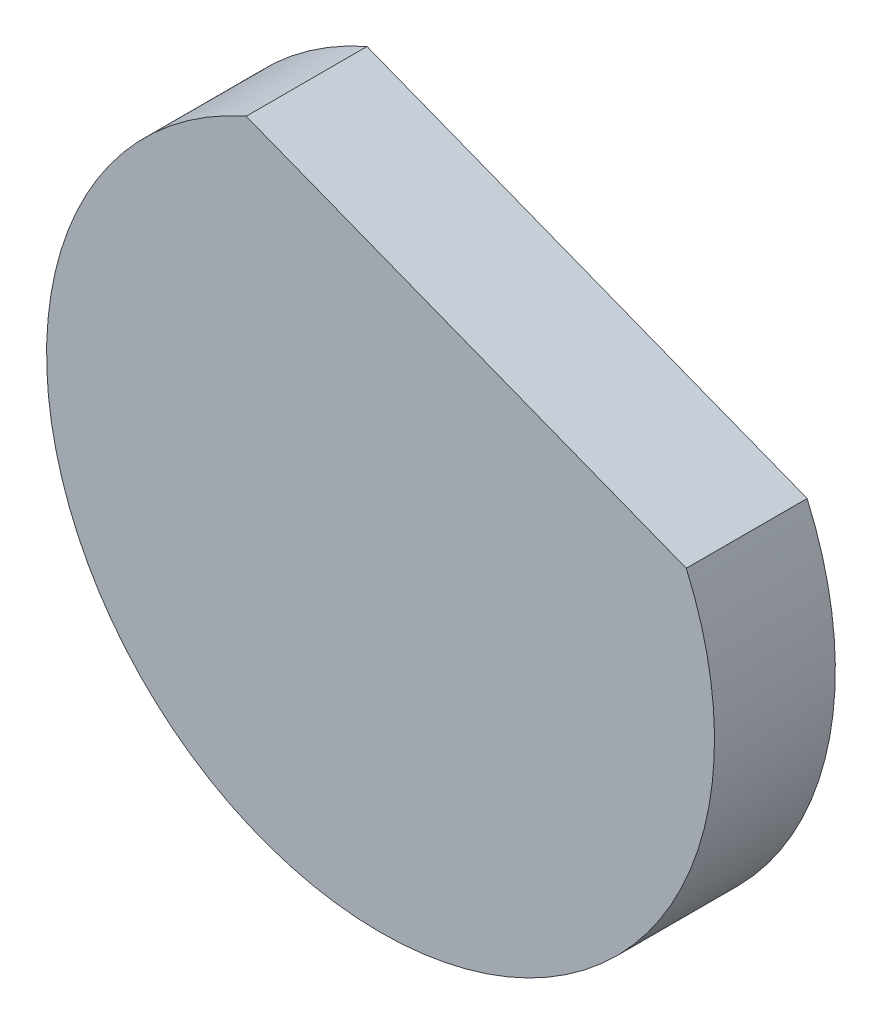
ISO-10303-21;
HEADER;
FILE_DESCRIPTION(('STEP AP214'),'2;1');
FILE_NAME('part.step','',(''),(''),'','','');
FILE_SCHEMA(('AUTOMOTIVE_DESIGN { 1 0 10303 214 1 1 1 1 }'));
ENDSEC;
DATA;
#1=APPLICATION_CONTEXT('core data for automotive mechanical design processes');
#2=APPLICATION_PROTOCOL_DEFINITION('international standard','automotive_design',2000,#1);
#3=PRODUCT_CONTEXT('',#1,'mechanical');
#4=PRODUCT('Part','Part','',(#3));
#5=PRODUCT_RELATED_PRODUCT_CATEGORY('part','',(#4));
#6=PRODUCT_DEFINITION_FORMATION('','',#4);
#7=PRODUCT_DEFINITION_CONTEXT('part definition',#1,'design');
#8=PRODUCT_DEFINITION('design','',#6,#7);
#9=PRODUCT_DEFINITION_SHAPE('','',#8);
#10=(LENGTH_UNIT() NAMED_UNIT(*) SI_UNIT(.MILLI.,.METRE.));
#11=(NAMED_UNIT(*) PLANE_ANGLE_UNIT() SI_UNIT($,.RADIAN.));
#12=(NAMED_UNIT(*) SI_UNIT($,.STERADIAN.) SOLID_ANGLE_UNIT());
#13=UNCERTAINTY_MEASURE_WITH_UNIT(LENGTH_MEASURE(1.E-05),#10,'distance_accuracy_value','');
#14=(GEOMETRIC_REPRESENTATION_CONTEXT(3) GLOBAL_UNCERTAINTY_ASSIGNED_CONTEXT((#13)) GLOBAL_UNIT_ASSIGNED_CONTEXT((#10,
#11,#12)) REPRESENTATION_CONTEXT('',''));
#15=CARTESIAN_POINT('',(0.,0.,0.));
#16=DIRECTION('',(0.,0.,1.));
#17=DIRECTION('',(1.,0.,0.));
#18=AXIS2_PLACEMENT_3D('',#15,#16,#17);
#19=CARTESIAN_POINT('',(-5.137,13.719,7.139));
#20=DIRECTION('',(0.,0.,-1.));
#21=DIRECTION('',(-1.,0.,0.));
#22=AXIS2_PLACEMENT_3D('',#19,#20,#21);
#23=CYLINDRICAL_SURFACE('',#22,19.731);
#24=CARTESIAN_POINT('',(-5.137,13.719,0.));
#25=DIRECTION('',(0.,0.,1.));
#26=DIRECTION('',(-1.,0.,0.));
#27=AXIS2_PLACEMENT_3D('',#24,#25,#26);
#28=CIRCLE('',#27,19.731);
#29=CARTESIAN_POINT('',(-13.0738223687564,31.7833076725018,0.));
#30=VERTEX_POINT('',#29);
#31=CARTESIAN_POINT('',(12.9273076725018,21.6558223687564,0.));
#32=VERTEX_POINT('',#31);
#33=EDGE_CURVE('E74',#30,#32,#28,.T.);
#34=ORIENTED_EDGE('',*,*,#33,.T.);
#35=DIRECTION('',(0.,0.,-1.));
#36=VECTOR('',#35,1.);
#37=CARTESIAN_POINT('',(12.9273076725018,21.6558223687564,7.139));
#38=LINE('',#37,#36);
#39=CARTESIAN_POINT('',(12.9273076725018,21.6558223687564,7.139));
#40=VERTEX_POINT('',#39);
#41=EDGE_CURVE('E11',#40,#32,#38,.T.);
#42=ORIENTED_EDGE('',*,*,#41,.F.);
#43=CARTESIAN_POINT('',(-5.137,13.719,7.139));
#44=DIRECTION('',(0.,0.,1.));
#45=DIRECTION('',(-1.,0.,0.));
#46=AXIS2_PLACEMENT_3D('',#43,#44,#45);
#47=CIRCLE('',#46,19.731);
#48=CARTESIAN_POINT('',(-13.0738223687564,31.7833076725018,7.139));
#49=VERTEX_POINT('',#48);
#50=EDGE_CURVE('E72',#49,#40,#47,.T.);
#51=ORIENTED_EDGE('',*,*,#50,.F.);
#52=DIRECTION('',(0.,0.,-1.));
#53=VECTOR('',#52,1.);
#54=CARTESIAN_POINT('',(-13.0738223687564,31.7833076725018,7.139));
#55=LINE('',#54,#53);
#56=EDGE_CURVE('E47',#49,#30,#55,.T.);
#57=ORIENTED_EDGE('',*,*,#56,.T.);
#58=EDGE_LOOP('',(#34,#42,#51,#57));
#59=FACE_BOUND('',#58,.T.);
#60=ADVANCED_FACE('F41',(#59),#23,.T.);
#61=CARTESIAN_POINT('',(-13.0738223687564,31.7833076725018,7.139));
#62=DIRECTION('',(-0.362942249994704,-0.931811635025439,0.));
#63=DIRECTION('',(0.931811635025439,-0.362942249994704,0.));
#64=AXIS2_PLACEMENT_3D('',#61,#62,#63);
#65=PLANE('',#64);
#66=DIRECTION('',(-0.931811635025439,0.362942249994704,0.));
#67=VECTOR('',#66,1.);
#68=CARTESIAN_POINT('',(-13.0738223687564,31.7833076725018,0.));
#69=LINE('',#68,#67);
#70=EDGE_CURVE('E61',#32,#30,#69,.T.);
#71=ORIENTED_EDGE('',*,*,#70,.T.);
#72=ORIENTED_EDGE('',*,*,#56,.F.);
#73=DIRECTION('',(-0.931811635025439,0.362942249994704,0.));
#74=VECTOR('',#73,1.);
#75=CARTESIAN_POINT('',(-13.0738223687564,31.7833076725018,7.139));
#76=LINE('',#75,#74);
#77=EDGE_CURVE('E57',#40,#49,#76,.T.);
#78=ORIENTED_EDGE('',*,*,#77,.F.);
#79=ORIENTED_EDGE('',*,*,#41,.T.);
#80=EDGE_LOOP('',(#71,#72,#78,#79));
#81=FACE_BOUND('',#80,.T.);
#82=ADVANCED_FACE('F70',(#81),#65,.F.);
#83=CARTESIAN_POINT('',(-5.137,13.719,7.139));
#84=DIRECTION('',(0.,0.,-1.));
#85=DIRECTION('',(-1.,0.,0.));
#86=AXIS2_PLACEMENT_3D('',#83,#84,#85);
#87=PLANE('',#86);
#88=ORIENTED_EDGE('',*,*,#50,.T.);
#89=ORIENTED_EDGE('',*,*,#77,.T.);
#90=EDGE_LOOP('',(#88,#89));
#91=FACE_BOUND('',#90,.T.);
#92=ADVANCED_FACE('F80',(#91),#87,.F.);
#93=CARTESIAN_POINT('',(-5.137,13.719,0.));
#94=DIRECTION('',(0.,0.,-1.));
#95=DIRECTION('',(-1.,0.,0.));
#96=AXIS2_PLACEMENT_3D('',#93,#94,#95);
#97=PLANE('',#96);
#98=ORIENTED_EDGE('',*,*,#33,.F.);
#99=ORIENTED_EDGE('',*,*,#70,.F.);
#100=EDGE_LOOP('',(#98,#99));
#101=FACE_BOUND('',#100,.T.);
#102=ADVANCED_FACE('F73',(#101),#97,.T.);
#103=CLOSED_SHELL('',(#60,#82,#92,#102));
#104=MANIFOLD_SOLID_BREP('B2',#103);
#105=ADVANCED_BREP_SHAPE_REPRESENTATION('',(#18,#104),#14);
#106=SHAPE_DEFINITION_REPRESENTATION(#9,#105);
ENDSEC;
END-ISO-10303-21;
